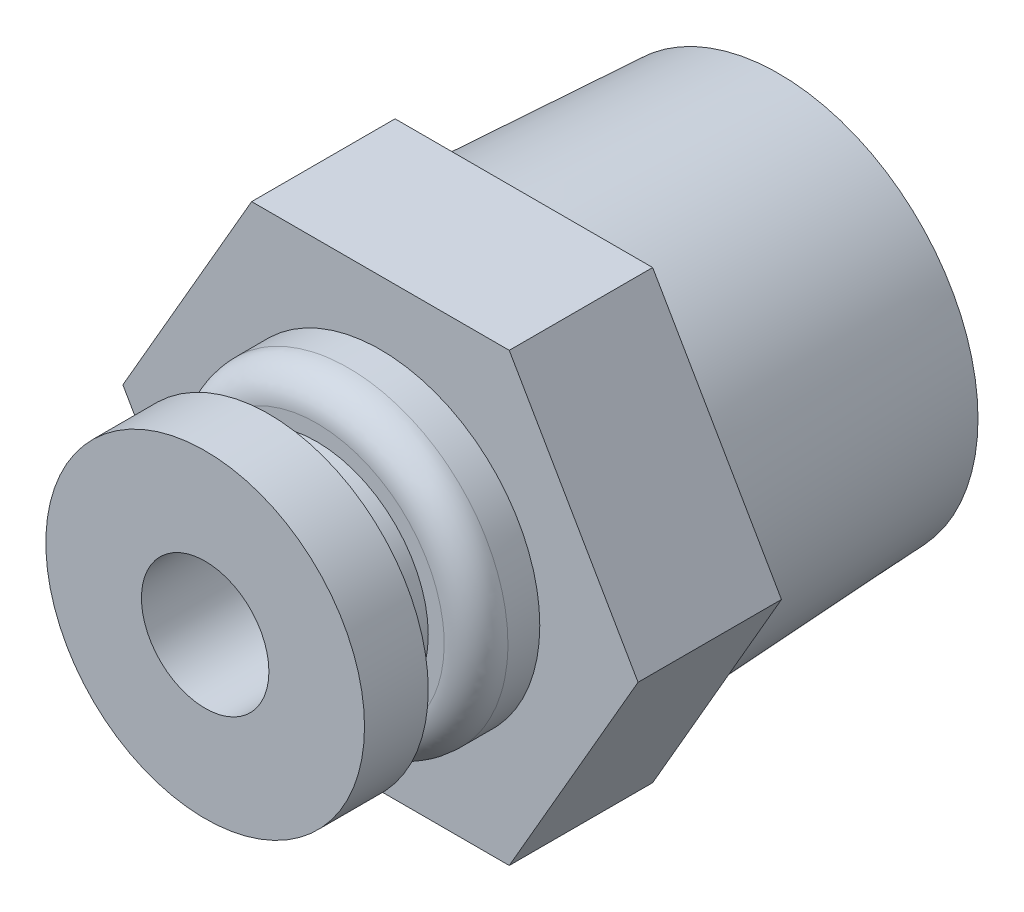
ISO-10303-21;
HEADER;
FILE_DESCRIPTION(('STEP AP214'),'2;1');
FILE_NAME('part.step','',(''),(''),'','','');
FILE_SCHEMA(('AUTOMOTIVE_DESIGN { 1 0 10303 214 1 1 1 1 }'));
ENDSEC;
DATA;
#1=APPLICATION_CONTEXT('core data for automotive mechanical design processes');
#2=APPLICATION_PROTOCOL_DEFINITION('international standard','automotive_design',2000,#1);
#3=PRODUCT_CONTEXT('',#1,'mechanical');
#4=PRODUCT('Part','Part','',(#3));
#5=PRODUCT_RELATED_PRODUCT_CATEGORY('part','',(#4));
#6=PRODUCT_DEFINITION_FORMATION('','',#4);
#7=PRODUCT_DEFINITION_CONTEXT('part definition',#1,'design');
#8=PRODUCT_DEFINITION('design','',#6,#7);
#9=PRODUCT_DEFINITION_SHAPE('','',#8);
#10=(LENGTH_UNIT() NAMED_UNIT(*) SI_UNIT(.MILLI.,.METRE.));
#11=(NAMED_UNIT(*) PLANE_ANGLE_UNIT() SI_UNIT($,.RADIAN.));
#12=(NAMED_UNIT(*) SI_UNIT($,.STERADIAN.) SOLID_ANGLE_UNIT());
#13=UNCERTAINTY_MEASURE_WITH_UNIT(LENGTH_MEASURE(1.E-05),#10,'distance_accuracy_value','');
#14=(GEOMETRIC_REPRESENTATION_CONTEXT(3) GLOBAL_UNCERTAINTY_ASSIGNED_CONTEXT((#13)) GLOBAL_UNIT_ASSIGNED_CONTEXT((#10,
#11,#12)) REPRESENTATION_CONTEXT('',''));
#15=CARTESIAN_POINT('',(0.,0.,0.));
#16=DIRECTION('',(0.,0.,1.));
#17=DIRECTION('',(1.,0.,0.));
#18=AXIS2_PLACEMENT_3D('',#15,#16,#17);
#19=CARTESIAN_POINT('',(0.,0.,0.));
#20=DIRECTION('',(0.,0.,1.));
#21=DIRECTION('',(1.,0.,0.));
#22=AXIS2_PLACEMENT_3D('',#19,#20,#21);
#23=CONICAL_SURFACE('',#22,6.25,0.05235987755983);
#24=CARTESIAN_POINT('',(0.,0.,8.));
#25=DIRECTION('',(0.,0.,1.));
#26=DIRECTION('',(1.,0.,0.));
#27=AXIS2_PLACEMENT_3D('',#24,#25,#26);
#28=CIRCLE('',#27,6.66926223426433);
#29=CARTESIAN_POINT('',(6.66926223426433,0.,8.));
#30=VERTEX_POINT('',#29);
#31=EDGE_CURVE('E168',#30,#30,#28,.T.);
#32=ORIENTED_EDGE('',*,*,#31,.F.);
#33=EDGE_LOOP('',(#32));
#34=FACE_BOUND('',#33,.T.);
#35=CARTESIAN_POINT('',(0.,0.,0.));
#36=DIRECTION('',(0.,0.,1.));
#37=DIRECTION('',(1.,0.,0.));
#38=AXIS2_PLACEMENT_3D('',#35,#36,#37);
#39=CIRCLE('',#38,6.25);
#40=CARTESIAN_POINT('',(6.25,0.,0.));
#41=VERTEX_POINT('',#40);
#42=EDGE_CURVE('E165',#41,#41,#39,.T.);
#43=ORIENTED_EDGE('',*,*,#42,.T.);
#44=EDGE_LOOP('',(#43));
#45=FACE_BOUND('',#44,.T.);
#46=ADVANCED_FACE('F41',(#34,#45),#23,.T.);
#47=CARTESIAN_POINT('',(0.,0.,0.));
#48=DIRECTION('',(0.,0.,1.));
#49=DIRECTION('',(1.,0.,0.));
#50=AXIS2_PLACEMENT_3D('',#47,#48,#49);
#51=PLANE('',#50);
#52=CARTESIAN_POINT('',(0.,0.,0.));
#53=DIRECTION('',(0.,0.,-1.));
#54=DIRECTION('',(-1.,0.,0.));
#55=AXIS2_PLACEMENT_3D('',#52,#53,#54);
#56=CIRCLE('',#55,4.5);
#57=CARTESIAN_POINT('',(-4.5,0.,0.));
#58=VERTEX_POINT('',#57);
#59=EDGE_CURVE('E486',#58,#58,#56,.T.);
#60=ORIENTED_EDGE('',*,*,#59,.F.);
#61=EDGE_LOOP('',(#60));
#62=FACE_BOUND('',#61,.T.);
#63=ORIENTED_EDGE('',*,*,#42,.F.);
#64=EDGE_LOOP('',(#63));
#65=FACE_BOUND('',#64,.T.);
#66=ADVANCED_FACE('F243',(#62,#65),#51,.F.);
#67=CARTESIAN_POINT('',(4.04145188432738,-7.,12.5));
#68=DIRECTION('',(-0.866025403784439,0.499999999999999,0.));
#69=DIRECTION('',(-0.499999999999999,-0.866025403784439,0.));
#70=AXIS2_PLACEMENT_3D('',#67,#68,#69);
#71=PLANE('',#70);
#72=DIRECTION('',(0.499999999999999,0.866025403784439,0.));
#73=VECTOR('',#72,1.);
#74=CARTESIAN_POINT('',(4.04145188432738,-7.,8.));
#75=LINE('',#74,#73);
#76=CARTESIAN_POINT('',(4.04145188432738,-7.,8.));
#77=VERTEX_POINT('',#76);
#78=CARTESIAN_POINT('',(8.08290376865476,0.,8.));
#79=VERTEX_POINT('',#78);
#80=EDGE_CURVE('E144',#77,#79,#75,.T.);
#81=ORIENTED_EDGE('',*,*,#80,.T.);
#82=DIRECTION('',(0.,0.,-1.));
#83=VECTOR('',#82,1.);
#84=CARTESIAN_POINT('',(8.08290376865476,0.,12.5));
#85=LINE('',#84,#83);
#86=CARTESIAN_POINT('',(8.08290376865476,0.,12.5));
#87=VERTEX_POINT('',#86);
#88=EDGE_CURVE('E163',#87,#79,#85,.T.);
#89=ORIENTED_EDGE('',*,*,#88,.F.);
#90=DIRECTION('',(0.499999999999999,0.866025403784439,0.));
#91=VECTOR('',#90,1.);
#92=CARTESIAN_POINT('',(4.04145188432738,-7.,12.5));
#93=LINE('',#92,#91);
#94=CARTESIAN_POINT('',(4.04145188432738,-7.,12.5));
#95=VERTEX_POINT('',#94);
#96=EDGE_CURVE('E156',#95,#87,#93,.T.);
#97=ORIENTED_EDGE('',*,*,#96,.F.);
#98=DIRECTION('',(0.,0.,-1.));
#99=VECTOR('',#98,1.);
#100=CARTESIAN_POINT('',(4.04145188432738,-7.,12.5));
#101=LINE('',#100,#99);
#102=EDGE_CURVE('E140',#95,#77,#101,.T.);
#103=ORIENTED_EDGE('',*,*,#102,.T.);
#104=EDGE_LOOP('',(#81,#89,#97,#103));
#105=FACE_BOUND('',#104,.T.);
#106=ADVANCED_FACE('F241',(#105),#71,.F.);
#107=CARTESIAN_POINT('',(8.08290376865476,0.,12.5));
#108=DIRECTION('',(-0.866025403784438,-0.5,0.));
#109=DIRECTION('',(0.5,-0.866025403784439,0.));
#110=AXIS2_PLACEMENT_3D('',#107,#108,#109);
#111=PLANE('',#110);
#112=DIRECTION('',(-0.5,0.866025403784438,0.));
#113=VECTOR('',#112,1.);
#114=CARTESIAN_POINT('',(8.08290376865476,0.,8.));
#115=LINE('',#114,#113);
#116=CARTESIAN_POINT('',(4.04145188432738,7.,8.));
#117=VERTEX_POINT('',#116);
#118=EDGE_CURVE('E147',#79,#117,#115,.T.);
#119=ORIENTED_EDGE('',*,*,#118,.T.);
#120=DIRECTION('',(0.,0.,-1.));
#121=VECTOR('',#120,1.);
#122=CARTESIAN_POINT('',(4.04145188432738,7.,12.5));
#123=LINE('',#122,#121);
#124=CARTESIAN_POINT('',(4.04145188432738,7.,12.5));
#125=VERTEX_POINT('',#124);
#126=EDGE_CURVE('E160',#125,#117,#123,.T.);
#127=ORIENTED_EDGE('',*,*,#126,.F.);
#128=DIRECTION('',(-0.5,0.866025403784438,0.));
#129=VECTOR('',#128,1.);
#130=CARTESIAN_POINT('',(8.08290376865476,0.,12.5));
#131=LINE('',#130,#129);
#132=EDGE_CURVE('E107',#87,#125,#131,.T.);
#133=ORIENTED_EDGE('',*,*,#132,.F.);
#134=ORIENTED_EDGE('',*,*,#88,.T.);
#135=EDGE_LOOP('',(#119,#127,#133,#134));
#136=FACE_BOUND('',#135,.T.);
#137=ADVANCED_FACE('F233',(#136),#111,.F.);
#138=CARTESIAN_POINT('',(4.04145188432738,7.,12.5));
#139=DIRECTION('',(0.,-1.,0.));
#140=DIRECTION('',(1.,0.,0.));
#141=AXIS2_PLACEMENT_3D('',#138,#139,#140);
#142=PLANE('',#141);
#143=DIRECTION('',(-1.,0.,0.));
#144=VECTOR('',#143,1.);
#145=CARTESIAN_POINT('',(4.04145188432738,7.,8.));
#146=LINE('',#145,#144);
#147=CARTESIAN_POINT('',(-4.04145188432738,7.,8.));
#148=VERTEX_POINT('',#147);
#149=EDGE_CURVE('E150',#117,#148,#146,.T.);
#150=ORIENTED_EDGE('',*,*,#149,.T.);
#151=DIRECTION('',(0.,0.,-1.));
#152=VECTOR('',#151,1.);
#153=CARTESIAN_POINT('',(-4.04145188432738,7.,12.5));
#154=LINE('',#153,#152);
#155=CARTESIAN_POINT('',(-4.04145188432738,7.,12.5));
#156=VERTEX_POINT('',#155);
#157=EDGE_CURVE('E135',#156,#148,#154,.T.);
#158=ORIENTED_EDGE('',*,*,#157,.F.);
#159=DIRECTION('',(-1.,0.,0.));
#160=VECTOR('',#159,1.);
#161=CARTESIAN_POINT('',(4.04145188432738,7.,12.5));
#162=LINE('',#161,#160);
#163=EDGE_CURVE('E123',#125,#156,#162,.T.);
#164=ORIENTED_EDGE('',*,*,#163,.F.);
#165=ORIENTED_EDGE('',*,*,#126,.T.);
#166=EDGE_LOOP('',(#150,#158,#164,#165));
#167=FACE_BOUND('',#166,.T.);
#168=ADVANCED_FACE('F236',(#167),#142,.F.);
#169=CARTESIAN_POINT('',(-4.04145188432738,7.,12.5));
#170=DIRECTION('',(0.866025403784439,-0.499999999999999,0.));
#171=DIRECTION('',(0.5,0.866025403784439,0.));
#172=AXIS2_PLACEMENT_3D('',#169,#170,#171);
#173=PLANE('',#172);
#174=DIRECTION('',(-0.499999999999999,-0.866025403784439,0.));
#175=VECTOR('',#174,1.);
#176=CARTESIAN_POINT('',(-4.04145188432738,7.,8.));
#177=LINE('',#176,#175);
#178=CARTESIAN_POINT('',(-8.08290376865476,0.,8.));
#179=VERTEX_POINT('',#178);
#180=EDGE_CURVE('E132',#148,#179,#177,.T.);
#181=ORIENTED_EDGE('',*,*,#180,.T.);
#182=DIRECTION('',(0.,0.,-1.));
#183=VECTOR('',#182,1.);
#184=CARTESIAN_POINT('',(-8.08290376865476,0.,12.5));
#185=LINE('',#184,#183);
#186=CARTESIAN_POINT('',(-8.08290376865476,0.,12.5));
#187=VERTEX_POINT('',#186);
#188=EDGE_CURVE('E129',#187,#179,#185,.T.);
#189=ORIENTED_EDGE('',*,*,#188,.F.);
#190=DIRECTION('',(-0.499999999999999,-0.866025403784439,0.));
#191=VECTOR('',#190,1.);
#192=CARTESIAN_POINT('',(-4.04145188432738,7.,12.5));
#193=LINE('',#192,#191);
#194=EDGE_CURVE('E116',#156,#187,#193,.T.);
#195=ORIENTED_EDGE('',*,*,#194,.F.);
#196=ORIENTED_EDGE('',*,*,#157,.T.);
#197=EDGE_LOOP('',(#181,#189,#195,#196));
#198=FACE_BOUND('',#197,.T.);
#199=ADVANCED_FACE('F130',(#198),#173,.F.);
#200=CARTESIAN_POINT('',(-8.08290376865476,0.,12.5));
#201=DIRECTION('',(0.866025403784438,0.5,0.));
#202=DIRECTION('',(-0.5,0.866025403784438,0.));
#203=AXIS2_PLACEMENT_3D('',#200,#201,#202);
#204=PLANE('',#203);
#205=DIRECTION('',(0.5,-0.866025403784438,0.));
#206=VECTOR('',#205,1.);
#207=CARTESIAN_POINT('',(-8.08290376865476,0.,8.));
#208=LINE('',#207,#206);
#209=CARTESIAN_POINT('',(-4.04145188432738,-7.,8.));
#210=VERTEX_POINT('',#209);
#211=EDGE_CURVE('E153',#179,#210,#208,.T.);
#212=ORIENTED_EDGE('',*,*,#211,.T.);
#213=DIRECTION('',(0.,0.,-1.));
#214=VECTOR('',#213,1.);
#215=CARTESIAN_POINT('',(-4.04145188432738,-7.,12.5));
#216=LINE('',#215,#214);
#217=CARTESIAN_POINT('',(-4.04145188432738,-7.,12.5));
#218=VERTEX_POINT('',#217);
#219=EDGE_CURVE('E136',#218,#210,#216,.T.);
#220=ORIENTED_EDGE('',*,*,#219,.F.);
#221=DIRECTION('',(0.5,-0.866025403784438,0.));
#222=VECTOR('',#221,1.);
#223=CARTESIAN_POINT('',(-8.08290376865476,0.,12.5));
#224=LINE('',#223,#222);
#225=EDGE_CURVE('E120',#187,#218,#224,.T.);
#226=ORIENTED_EDGE('',*,*,#225,.F.);
#227=ORIENTED_EDGE('',*,*,#188,.T.);
#228=EDGE_LOOP('',(#212,#220,#226,#227));
#229=FACE_BOUND('',#228,.T.);
#230=ADVANCED_FACE('F138',(#229),#204,.F.);
#231=CARTESIAN_POINT('',(-4.04145188432738,-7.,12.5));
#232=DIRECTION('',(0.,1.,0.));
#233=DIRECTION('',(-1.,0.,0.));
#234=AXIS2_PLACEMENT_3D('',#231,#232,#233);
#235=PLANE('',#234);
#236=DIRECTION('',(1.,0.,0.));
#237=VECTOR('',#236,1.);
#238=CARTESIAN_POINT('',(-4.04145188432738,-7.,8.));
#239=LINE('',#238,#237);
#240=EDGE_CURVE('E98',#210,#77,#239,.T.);
#241=ORIENTED_EDGE('',*,*,#240,.T.);
#242=ORIENTED_EDGE('',*,*,#102,.F.);
#243=DIRECTION('',(1.,0.,0.));
#244=VECTOR('',#243,1.);
#245=CARTESIAN_POINT('',(-4.04145188432738,-7.,12.5));
#246=LINE('',#245,#244);
#247=EDGE_CURVE('E71',#218,#95,#246,.T.);
#248=ORIENTED_EDGE('',*,*,#247,.F.);
#249=ORIENTED_EDGE('',*,*,#219,.T.);
#250=EDGE_LOOP('',(#241,#242,#248,#249));
#251=FACE_BOUND('',#250,.T.);
#252=ADVANCED_FACE('F239',(#251),#235,.F.);
#253=CARTESIAN_POINT('',(0.,0.,12.5));
#254=DIRECTION('',(0.,0.,1.));
#255=DIRECTION('',(1.,0.,0.));
#256=AXIS2_PLACEMENT_3D('',#253,#254,#255);
#257=PLANE('',#256);
#258=CARTESIAN_POINT('',(0.,0.,12.5));
#259=DIRECTION('',(0.,0.,1.));
#260=DIRECTION('',(1.,0.,0.));
#261=AXIS2_PLACEMENT_3D('',#258,#259,#260);
#262=CIRCLE('',#261,5.);
#263=CARTESIAN_POINT('',(5.,0.,12.5));
#264=VERTEX_POINT('',#263);
#265=EDGE_CURVE('E171',#264,#264,#262,.T.);
#266=ORIENTED_EDGE('',*,*,#265,.F.);
#267=EDGE_LOOP('',(#266));
#268=FACE_BOUND('',#267,.T.);
#269=ORIENTED_EDGE('',*,*,#96,.T.);
#270=ORIENTED_EDGE('',*,*,#132,.T.);
#271=ORIENTED_EDGE('',*,*,#163,.T.);
#272=ORIENTED_EDGE('',*,*,#194,.T.);
#273=ORIENTED_EDGE('',*,*,#225,.T.);
#274=ORIENTED_EDGE('',*,*,#247,.T.);
#275=EDGE_LOOP('',(#269,#270,#271,#272,#273,#274));
#276=FACE_BOUND('',#275,.T.);
#277=ADVANCED_FACE('F118',(#268,#276),#257,.T.);
#278=CARTESIAN_POINT('',(0.,0.,8.));
#279=DIRECTION('',(0.,0.,1.));
#280=DIRECTION('',(1.,0.,0.));
#281=AXIS2_PLACEMENT_3D('',#278,#279,#280);
#282=PLANE('',#281);
#283=ORIENTED_EDGE('',*,*,#31,.T.);
#284=EDGE_LOOP('',(#283));
#285=FACE_BOUND('',#284,.T.);
#286=ORIENTED_EDGE('',*,*,#80,.F.);
#287=ORIENTED_EDGE('',*,*,#240,.F.);
#288=ORIENTED_EDGE('',*,*,#211,.F.);
#289=ORIENTED_EDGE('',*,*,#180,.F.);
#290=ORIENTED_EDGE('',*,*,#149,.F.);
#291=ORIENTED_EDGE('',*,*,#118,.F.);
#292=EDGE_LOOP('',(#286,#287,#288,#289,#290,#291));
#293=FACE_BOUND('',#292,.T.);
#294=ADVANCED_FACE('F199',(#285,#293),#282,.F.);
#295=CARTESIAN_POINT('',(0.,0.,14.5));
#296=DIRECTION('',(0.,0.,-1.));
#297=DIRECTION('',(-1.,0.,0.));
#298=AXIS2_PLACEMENT_3D('',#295,#296,#297);
#299=CYLINDRICAL_SURFACE('',#298,5.);
#300=CARTESIAN_POINT('',(5.,0.,13.5));
#301=CARTESIAN_POINT('',(5.,0.654498465135206,13.5));
#302=CARTESIAN_POINT('',(4.86986338167185,1.30873942582747,13.5));
#303=CARTESIAN_POINT('',(4.36893194344101,2.51809489782343,13.5));
#304=CARTESIAN_POINT('',(3.99833420890498,3.0727336029605,13.5));
#305=CARTESIAN_POINT('',(3.0727336029605,3.99833420890498,13.5));
#306=CARTESIAN_POINT('',(2.51809489782326,4.36893194344108,13.5));
#307=CARTESIAN_POINT('',(1.30873942582763,4.86986338167179,13.5));
#308=CARTESIAN_POINT('',(0.654498465134551,5.,13.5));
#309=CARTESIAN_POINT('',(-0.65449846513455,5.,13.5));
#310=CARTESIAN_POINT('',(-1.30873942582729,4.86986338167193,13.5));
#311=CARTESIAN_POINT('',(-2.51809489782361,4.36893194344094,13.5));
#312=CARTESIAN_POINT('',(-3.07273360296,3.99833420890547,13.5));
#313=CARTESIAN_POINT('',(-3.99833420890548,3.07273360296,13.5));
#314=CARTESIAN_POINT('',(-4.36893194344115,2.51809489782309,13.5));
#315=CARTESIAN_POINT('',(-4.86986338167171,1.30873942582782,13.5));
#316=CARTESIAN_POINT('',(-5.,0.654498465134426,13.5));
#317=CARTESIAN_POINT('',(-5.,-0.654498465134425,13.5));
#318=CARTESIAN_POINT('',(-4.86986338167181,-1.30873942582757,13.5));
#319=CARTESIAN_POINT('',(-4.36893194344106,-2.51809489782332,13.5));
#320=CARTESIAN_POINT('',(-3.99833420890554,-3.07273360295993,13.5));
#321=CARTESIAN_POINT('',(-3.07273360295993,-3.99833420890555,13.5));
#322=CARTESIAN_POINT('',(-2.5180948978234,-4.36893194344102,13.5));
#323=CARTESIAN_POINT('',(-1.30873942582751,-4.86986338167184,13.5));
#324=CARTESIAN_POINT('',(-0.654498465134541,-5.,13.5));
#325=CARTESIAN_POINT('',(0.654498465134561,-5.,13.5));
#326=CARTESIAN_POINT('',(1.30873942582734,-4.86986338167191,13.5));
#327=CARTESIAN_POINT('',(2.51809489782355,-4.36893194344096,13.5));
#328=CARTESIAN_POINT('',(3.07273360296003,-3.99833420890545,13.5));
#329=CARTESIAN_POINT('',(3.99833420890543,-3.07273360296004,13.5));
#330=CARTESIAN_POINT('',(4.36893194344097,-2.51809489782352,13.5));
#331=CARTESIAN_POINT('',(4.86986338167189,-1.30873942582739,13.5));
#332=CARTESIAN_POINT('',(5.,-0.654498465135205,13.5));
#333=CARTESIAN_POINT('',(5.,0.,13.5));
#334=(BOUNDED_CURVE() B_SPLINE_CURVE(3,(#300,#301,#302,#303,#304,#305,#306,#307,#308,#309,#310,
#311,#312,#313,#314,#315,#316,#317,#318,#319,#320,#321,#322,#323,#324,#325,#326,#327,#328,#329,
#330,#331,#332,#333),.UNSPECIFIED.,.T.,.F.) B_SPLINE_CURVE_WITH_KNOTS((4,2,2,2,2,2,2,2,2,2,2,2,
2,2,2,2,4),(0.,0.392699081698724,0.785398163397448,1.17809724509617,1.5707963267949,
1.96349540849362,2.35619449019234,2.74889357189107,3.14159265358979,3.53429173528852,
3.92699081698724,4.31968989868597,4.71238898038469,5.10508806208341,5.49778714378214,
5.89048622548086,6.28318530717959),
.UNSPECIFIED.) CURVE() GEOMETRIC_REPRESENTATION_ITEM() RATIONAL_B_SPLINE_CURVE((1.,1.,1.,1.,1.,
1.,1.,1.,1.,1.,1.,1.,1.,1.,1.,1.,1.,1.,1.,1.,1.,1.,1.,1.,1.,1.,1.,1.,1.,1.,1.,1.,1.,1.)) REPRESENTATION_ITEM(''));
#335=CARTESIAN_POINT('',(5.,0.,13.5));
#336=VERTEX_POINT('',#335);
#337=EDGE_CURVE('E54',#336,#336,#334,.F.);
#338=ORIENTED_EDGE('',*,*,#337,.T.);
#339=EDGE_LOOP('',(#338));
#340=FACE_BOUND('',#339,.T.);
#341=ORIENTED_EDGE('',*,*,#265,.T.);
#342=EDGE_LOOP('',(#341));
#343=FACE_BOUND('',#342,.T.);
#344=ADVANCED_FACE('F194',(#340,#343),#299,.T.);
#345=CARTESIAN_POINT('',(0.,0.,14.5));
#346=DIRECTION('',(0.,0.,1.));
#347=DIRECTION('',(1.,0.,0.));
#348=AXIS2_PLACEMENT_3D('',#345,#346,#347);
#349=PLANE('',#348);
#350=CARTESIAN_POINT('',(4.,0.,14.5));
#351=CARTESIAN_POINT('',(4.,-0.523598772108514,14.5));
#352=CARTESIAN_POINT('',(3.89589070533714,-1.04699154066209,14.5));
#353=CARTESIAN_POINT('',(3.49514555475315,-2.01447591825864,14.5));
#354=CARTESIAN_POINT('',(3.19866736712426,-2.45818688236784,14.5));
#355=CARTESIAN_POINT('',(2.45818688236811,-3.19866736712456,14.5));
#356=CARTESIAN_POINT('',(2.01447591825849,-3.49514555475273,14.5));
#357=CARTESIAN_POINT('',(1.04699154066222,-3.89589070533757,14.5));
#358=CARTESIAN_POINT('',(0.523598772107647,-4.,14.5));
#359=CARTESIAN_POINT('',(-0.523598772107635,-4.,14.5));
#360=CARTESIAN_POINT('',(-1.04699154066209,-3.89589070533742,14.5));
#361=CARTESIAN_POINT('',(-2.01447591825864,-3.49514555475287,14.5));
#362=CARTESIAN_POINT('',(-2.45818688236786,-3.19866736712438,14.5));
#363=CARTESIAN_POINT('',(-3.19866736712452,-2.458186882368,14.5));
#364=CARTESIAN_POINT('',(-3.49514555475285,-2.01447591825864,14.5));
#365=CARTESIAN_POINT('',(-3.89589070533745,-1.04699154066207,14.5));
#366=CARTESIAN_POINT('',(-4.,-0.52359877210764,14.5));
#367=CARTESIAN_POINT('',(-4.,0.523598772107641,14.5));
#368=CARTESIAN_POINT('',(-3.8958907053373,1.04699154066222,14.5));
#369=CARTESIAN_POINT('',(-3.49514555475299,2.01447591825851,14.5));
#370=CARTESIAN_POINT('',(-3.19866736712452,2.458186882368,14.5));
#371=CARTESIAN_POINT('',(-2.45818688236786,3.19866736712438,14.5));
#372=CARTESIAN_POINT('',(-2.01447591825865,3.49514555475271,14.5));
#373=CARTESIAN_POINT('',(-1.04699154066207,3.89589070533759,14.5));
#374=CARTESIAN_POINT('',(-0.52359877210764,4.,14.5));
#375=CARTESIAN_POINT('',(0.52359877210764,4.,14.5));
#376=CARTESIAN_POINT('',(1.04699154066207,3.89589070533744,14.5));
#377=CARTESIAN_POINT('',(2.01447591825864,3.49514555475285,14.5));
#378=CARTESIAN_POINT('',(2.458186882368,3.19866736712452,14.5));
#379=CARTESIAN_POINT('',(3.19866736712438,2.45818688236786,14.5));
#380=CARTESIAN_POINT('',(3.49514555475285,2.01447591825857,14.5));
#381=CARTESIAN_POINT('',(3.89589070533745,1.04699154066214,14.5));
#382=CARTESIAN_POINT('',(4.,0.523598772108514,14.5));
#383=CARTESIAN_POINT('',(4.,0.,14.5));
#384=(BOUNDED_CURVE() B_SPLINE_CURVE(3,(#350,#351,#352,#353,#354,#355,#356,#357,#358,#359,#360,
#361,#362,#363,#364,#365,#366,#367,#368,#369,#370,#371,#372,#373,#374,#375,#376,#377,#378,#379,
#380,#381,#382,#383),.UNSPECIFIED.,.T.,.F.) B_SPLINE_CURVE_WITH_KNOTS((4,2,2,2,2,2,2,2,2,2,2,2,
2,2,2,2,4),(0.,0.392699081698725,0.785398163397448,1.17809724509617,1.5707963267949,
1.96349540849362,2.35619449019234,2.74889357189107,3.14159265358979,3.53429173528852,
3.92699081698724,4.31968989868597,4.71238898038469,5.10508806208341,5.49778714378214,
5.89048622548086,6.28318530717959),
.UNSPECIFIED.) CURVE() GEOMETRIC_REPRESENTATION_ITEM() RATIONAL_B_SPLINE_CURVE((1.,1.,1.,1.,1.,
1.,1.,1.,1.,1.,1.,1.,1.,1.,1.,1.,1.,1.,1.,1.,1.,1.,1.,1.,1.,1.,1.,1.,1.,1.,1.,1.,1.,1.)) REPRESENTATION_ITEM(''));
#385=CARTESIAN_POINT('',(4.,0.,14.5));
#386=VERTEX_POINT('',#385);
#387=EDGE_CURVE('E176',#386,#386,#384,.F.);
#388=ORIENTED_EDGE('',*,*,#387,.T.);
#389=EDGE_LOOP('',(#388));
#390=FACE_BOUND('',#389,.T.);
#391=CARTESIAN_POINT('',(0.,0.,14.5));
#392=DIRECTION('',(0.,0.,1.));
#393=DIRECTION('',(1.,0.,0.));
#394=AXIS2_PLACEMENT_3D('',#391,#392,#393);
#395=CIRCLE('',#394,3.5);
#396=CARTESIAN_POINT('',(3.5,0.,14.5));
#397=VERTEX_POINT('',#396);
#398=EDGE_CURVE('E221',#397,#397,#395,.T.);
#399=ORIENTED_EDGE('',*,*,#398,.F.);
#400=EDGE_LOOP('',(#399));
#401=FACE_BOUND('',#400,.T.);
#402=ADVANCED_FACE('F183',(#390,#401),#349,.T.);
#403=CARTESIAN_POINT('',(0.,0.,15.));
#404=DIRECTION('',(0.,0.,-1.));
#405=DIRECTION('',(-1.,0.,0.));
#406=AXIS2_PLACEMENT_3D('',#403,#404,#405);
#407=CYLINDRICAL_SURFACE('',#406,3.5);
#408=CARTESIAN_POINT('',(0.,0.,15.));
#409=DIRECTION('',(0.,0.,1.));
#410=DIRECTION('',(1.,0.,0.));
#411=AXIS2_PLACEMENT_3D('',#408,#409,#410);
#412=CIRCLE('',#411,3.5);
#413=CARTESIAN_POINT('',(3.5,0.,15.));
#414=VERTEX_POINT('',#413);
#415=EDGE_CURVE('E148',#414,#414,#412,.T.);
#416=ORIENTED_EDGE('',*,*,#415,.F.);
#417=EDGE_LOOP('',(#416));
#418=FACE_BOUND('',#417,.T.);
#419=ORIENTED_EDGE('',*,*,#398,.T.);
#420=EDGE_LOOP('',(#419));
#421=FACE_BOUND('',#420,.T.);
#422=ADVANCED_FACE('F193',(#418,#421),#407,.T.);
#423=CARTESIAN_POINT('',(0.,0.,15.));
#424=DIRECTION('',(0.,0.,1.));
#425=DIRECTION('',(1.,0.,0.));
#426=AXIS2_PLACEMENT_3D('',#423,#424,#425);
#427=PLANE('',#426);
#428=CARTESIAN_POINT('',(0.,0.,15.));
#429=DIRECTION('',(0.,0.,1.));
#430=DIRECTION('',(1.,0.,0.));
#431=AXIS2_PLACEMENT_3D('',#428,#429,#430);
#432=CIRCLE('',#431,3.);
#433=CARTESIAN_POINT('',(3.,0.,15.));
#434=VERTEX_POINT('',#433);
#435=EDGE_CURVE('E14',#434,#434,#432,.T.);
#436=ORIENTED_EDGE('',*,*,#435,.F.);
#437=EDGE_LOOP('',(#436));
#438=FACE_BOUND('',#437,.T.);
#439=ORIENTED_EDGE('',*,*,#415,.T.);
#440=EDGE_LOOP('',(#439));
#441=FACE_BOUND('',#440,.T.);
#442=ADVANCED_FACE('F305',(#438,#441),#427,.T.);
#443=CARTESIAN_POINT('',(4.,0.,14.5));
#444=CARTESIAN_POINT('',(4.,0.523598772108514,14.5));
#445=CARTESIAN_POINT('',(3.89589070533745,1.04699154066214,14.5));
#446=CARTESIAN_POINT('',(3.49514555475285,2.01447591825857,14.5));
#447=CARTESIAN_POINT('',(3.19866736712438,2.45818688236786,14.5));
#448=CARTESIAN_POINT('',(2.458186882368,3.19866736712452,14.5));
#449=CARTESIAN_POINT('',(2.01447591825864,3.49514555475285,14.5));
#450=CARTESIAN_POINT('',(1.04699154066207,3.89589070533744,14.5));
#451=CARTESIAN_POINT('',(0.52359877210764,4.,14.5));
#452=CARTESIAN_POINT('',(-0.52359877210764,4.,14.5));
#453=CARTESIAN_POINT('',(-1.04699154066207,3.89589070533759,14.5));
#454=CARTESIAN_POINT('',(-2.01447591825865,3.49514555475271,14.5));
#455=CARTESIAN_POINT('',(-2.45818688236786,3.19866736712438,14.5));
#456=CARTESIAN_POINT('',(-3.19866736712452,2.458186882368,14.5));
#457=CARTESIAN_POINT('',(-3.49514555475299,2.01447591825851,14.5));
#458=CARTESIAN_POINT('',(-3.8958907053373,1.04699154066222,14.5));
#459=CARTESIAN_POINT('',(-4.,0.523598772107641,14.5));
#460=CARTESIAN_POINT('',(-4.,-0.52359877210764,14.5));
#461=CARTESIAN_POINT('',(-3.89589070533745,-1.04699154066207,14.5));
#462=CARTESIAN_POINT('',(-3.49514555475285,-2.01447591825864,14.5));
#463=CARTESIAN_POINT('',(-3.19866736712452,-2.458186882368,14.5));
#464=CARTESIAN_POINT('',(-2.45818688236786,-3.19866736712438,14.5));
#465=CARTESIAN_POINT('',(-2.01447591825864,-3.49514555475287,14.5));
#466=CARTESIAN_POINT('',(-1.04699154066209,-3.89589070533742,14.5));
#467=CARTESIAN_POINT('',(-0.523598772107635,-4.,14.5));
#468=CARTESIAN_POINT('',(0.523598772107647,-4.,14.5));
#469=CARTESIAN_POINT('',(1.04699154066222,-3.89589070533757,14.5));
#470=CARTESIAN_POINT('',(2.01447591825849,-3.49514555475273,14.5));
#471=CARTESIAN_POINT('',(2.45818688236811,-3.19866736712456,14.5));
#472=CARTESIAN_POINT('',(3.19866736712426,-2.45818688236784,14.5));
#473=CARTESIAN_POINT('',(3.49514555475315,-2.01447591825864,14.5));
#474=CARTESIAN_POINT('',(3.89589070533714,-1.04699154066209,14.5));
#475=CARTESIAN_POINT('',(4.,-0.523598772108514,14.5));
#476=CARTESIAN_POINT('',(4.,0.,14.5));
#477=CARTESIAN_POINT('',(5.,0.,14.5));
#478=CARTESIAN_POINT('',(5.,0.654498465135206,14.5));
#479=CARTESIAN_POINT('',(4.86986338167206,1.3087394258277,14.5));
#480=CARTESIAN_POINT('',(4.36893194344082,2.5180948978232,14.5));
#481=CARTESIAN_POINT('',(3.99833420890484,3.0727336029605,14.5));
#482=CARTESIAN_POINT('',(3.07273360296064,3.99833420890498,14.5));
#483=CARTESIAN_POINT('',(2.5180948978232,4.3689319434411,14.5));
#484=CARTESIAN_POINT('',(1.30873942582769,4.86986338167177,14.5));
#485=CARTESIAN_POINT('',(0.654498465134552,5.,14.5));
#486=CARTESIAN_POINT('',(-0.65449846513455,5.,14.5));
#487=CARTESIAN_POINT('',(-1.30873942582741,4.86986338167206,14.5));
#488=CARTESIAN_POINT('',(-2.51809489782349,4.36893194344081,14.5));
#489=CARTESIAN_POINT('',(-3.07273360295993,3.9983342089054,14.5));
#490=CARTESIAN_POINT('',(-3.99833420890555,3.07273360296007,14.5));
#491=CARTESIAN_POINT('',(-4.3689319434411,2.51809489782293,14.5));
#492=CARTESIAN_POINT('',(-4.86986338167177,1.30873942582799,14.5));
#493=CARTESIAN_POINT('',(-5.,0.654498465134426,14.5));
#494=CARTESIAN_POINT('',(-5.,-0.654498465134425,14.5));
#495=CARTESIAN_POINT('',(-4.86986338167177,-1.30873942582762,14.5));
#496=CARTESIAN_POINT('',(-4.3689319434411,-2.51809489782327,14.5));
#497=CARTESIAN_POINT('',(-3.99833420890583,-3.07273360295994,14.5));
#498=CARTESIAN_POINT('',(-3.07273360295964,-3.99833420890555,14.5));
#499=CARTESIAN_POINT('',(-2.51809489782342,-4.36893194344109,14.5));
#500=CARTESIAN_POINT('',(-1.30873942582748,-4.86986338167178,14.5));
#501=CARTESIAN_POINT('',(-0.654498465134542,-5.,14.5));
#502=CARTESIAN_POINT('',(0.654498465134561,-5.,14.5));
#503=CARTESIAN_POINT('',(1.30873942582733,-4.86986338167207,14.5));
#504=CARTESIAN_POINT('',(2.51809489782356,-4.36893194344081,14.5));
#505=CARTESIAN_POINT('',(3.0727336029601,-3.99833420890538,14.5));
#506=CARTESIAN_POINT('',(3.99833420890536,-3.07273360296012,14.5));
#507=CARTESIAN_POINT('',(4.36893194344109,-2.51809489782371,14.5));
#508=CARTESIAN_POINT('',(4.86986338167178,-1.3087394258272,14.5));
#509=CARTESIAN_POINT('',(5.,-0.654498465135205,14.5));
#510=CARTESIAN_POINT('',(5.,0.,14.5));
#511=CARTESIAN_POINT('',(5.,0.,13.5));
#512=CARTESIAN_POINT('',(5.,0.654498465135206,13.5));
#513=CARTESIAN_POINT('',(4.86986338167185,1.30873942582747,13.5));
#514=CARTESIAN_POINT('',(4.36893194344101,2.51809489782343,13.5));
#515=CARTESIAN_POINT('',(3.99833420890498,3.0727336029605,13.5));
#516=CARTESIAN_POINT('',(3.0727336029605,3.99833420890498,13.5));
#517=CARTESIAN_POINT('',(2.51809489782326,4.36893194344108,13.5));
#518=CARTESIAN_POINT('',(1.30873942582763,4.86986338167179,13.5));
#519=CARTESIAN_POINT('',(0.654498465134551,5.,13.5));
#520=CARTESIAN_POINT('',(-0.65449846513455,5.,13.5));
#521=CARTESIAN_POINT('',(-1.30873942582729,4.86986338167193,13.5));
#522=CARTESIAN_POINT('',(-2.51809489782361,4.36893194344094,13.5));
#523=CARTESIAN_POINT('',(-3.07273360296,3.99833420890547,13.5));
#524=CARTESIAN_POINT('',(-3.99833420890548,3.07273360296,13.5));
#525=CARTESIAN_POINT('',(-4.36893194344115,2.51809489782309,13.5));
#526=CARTESIAN_POINT('',(-4.86986338167171,1.30873942582782,13.5));
#527=CARTESIAN_POINT('',(-5.,0.654498465134426,13.5));
#528=CARTESIAN_POINT('',(-5.,-0.654498465134425,13.5));
#529=CARTESIAN_POINT('',(-4.86986338167181,-1.30873942582757,13.5));
#530=CARTESIAN_POINT('',(-4.36893194344106,-2.51809489782332,13.5));
#531=CARTESIAN_POINT('',(-3.99833420890554,-3.07273360295993,13.5));
#532=CARTESIAN_POINT('',(-3.07273360295993,-3.99833420890555,13.5));
#533=CARTESIAN_POINT('',(-2.5180948978234,-4.36893194344102,13.5));
#534=CARTESIAN_POINT('',(-1.30873942582751,-4.86986338167184,13.5));
#535=CARTESIAN_POINT('',(-0.654498465134541,-5.,13.5));
#536=CARTESIAN_POINT('',(0.654498465134561,-5.,13.5));
#537=CARTESIAN_POINT('',(1.30873942582734,-4.86986338167191,13.5));
#538=CARTESIAN_POINT('',(2.51809489782355,-4.36893194344096,13.5));
#539=CARTESIAN_POINT('',(3.07273360296003,-3.99833420890545,13.5));
#540=CARTESIAN_POINT('',(3.99833420890543,-3.07273360296004,13.5));
#541=CARTESIAN_POINT('',(4.36893194344097,-2.51809489782352,13.5));
#542=CARTESIAN_POINT('',(4.86986338167189,-1.30873942582739,13.5));
#543=CARTESIAN_POINT('',(5.,-0.654498465135205,13.5));
#544=CARTESIAN_POINT('',(5.,0.,13.5));
#545=(BOUNDED_SURFACE() B_SPLINE_SURFACE(2,3,((#443,#444,#445,#446,#447,#448,#449,#450,#451,
#452,#453,#454,#455,#456,#457,#458,#459,#460,#461,#462,#463,#464,#465,#466,#467,#468,#469,#470,
#471,#472,#473,#474,#475,#476),(#477,#478,#479,#480,#481,#482,#483,#484,#485,#486,#487,#488,
#489,#490,#491,#492,#493,#494,#495,#496,#497,#498,#499,#500,#501,#502,#503,#504,#505,#506,#507,
#508,#509,#510),(#511,#512,#513,#514,#515,#516,#517,#518,#519,#520,#521,#522,#523,#524,#525,
#526,#527,#528,#529,#530,#531,#532,#533,#534,#535,#536,#537,#538,#539,#540,#541,#542,#543,
#544)),.UNSPECIFIED.,.F.,.T.,.F.) B_SPLINE_SURFACE_WITH_KNOTS((3,3),(4,2,2,2,2,2,2,2,2,2,2,2,2,
2,2,2,4),(0.,1.),(0.,0.392699081698724,0.785398163397448,1.17809724509617,1.5707963267949,
1.96349540849362,2.35619449019234,2.74889357189107,3.14159265358979,3.53429173528852,
3.92699081698724,4.31968989868597,4.71238898038469,5.10508806208341,5.49778714378214,
5.89048622548086,6.28318530717959),
.UNSPECIFIED.) GEOMETRIC_REPRESENTATION_ITEM() RATIONAL_B_SPLINE_SURFACE(((1.,1.,1.,1.,1.,1.,1.,
1.,1.,1.,1.,1.,1.,1.,1.,1.,1.,1.,1.,1.,1.,1.,1.,1.,1.,1.,1.,1.,1.,1.,1.,1.,1.,1.),
(0.707106781186547,0.707106781186547,0.707106781186547,0.707106781186547,0.707106781186547,
0.707106781186547,0.707106781186547,0.707106781186547,0.707106781186547,0.707106781186547,
0.707106781186547,0.707106781186547,0.707106781186547,0.707106781186547,0.707106781186547,
0.707106781186547,0.707106781186547,0.707106781186547,0.707106781186547,0.707106781186547,
0.707106781186547,0.707106781186547,0.707106781186547,0.707106781186547,0.707106781186547,
0.707106781186547,0.707106781186547,0.707106781186547,0.707106781186547,0.707106781186547,
0.707106781186547,0.707106781186547,0.707106781186547,0.707106781186547),(1.,1.,1.,1.,1.,1.,1.,
1.,1.,1.,1.,1.,1.,1.,1.,1.,1.,1.,1.,1.,1.,1.,1.,1.,1.,1.,1.,1.,1.,1.,1.,1.,1.,1.))) REPRESENTATION_ITEM('') SURFACE());
#546=ORIENTED_EDGE('',*,*,#337,.F.);
#547=EDGE_LOOP('',(#546));
#548=FACE_BOUND('',#547,.T.);
#549=ORIENTED_EDGE('',*,*,#387,.F.);
#550=EDGE_LOOP('',(#549));
#551=FACE_BOUND('',#550,.T.);
#552=ADVANCED_FACE('F43',(#548,#551),#545,.T.);
#553=CARTESIAN_POINT('',(0.,0.,16.));
#554=DIRECTION('',(0.,0.,-1.));
#555=DIRECTION('',(-1.,0.,0.));
#556=AXIS2_PLACEMENT_3D('',#553,#554,#555);
#557=CYLINDRICAL_SURFACE('',#556,3.);
#558=CARTESIAN_POINT('',(0.,0.,16.));
#559=DIRECTION('',(0.,0.,1.));
#560=DIRECTION('',(1.,0.,0.));
#561=AXIS2_PLACEMENT_3D('',#558,#559,#560);
#562=CIRCLE('',#561,3.);
#563=CARTESIAN_POINT('',(3.,0.,16.));
#564=VERTEX_POINT('',#563);
#565=EDGE_CURVE('E553',#564,#564,#562,.T.);
#566=ORIENTED_EDGE('',*,*,#565,.F.);
#567=EDGE_LOOP('',(#566));
#568=FACE_BOUND('',#567,.T.);
#569=ORIENTED_EDGE('',*,*,#435,.T.);
#570=EDGE_LOOP('',(#569));
#571=FACE_BOUND('',#570,.T.);
#572=ADVANCED_FACE('F328',(#568,#571),#557,.T.);
#573=CARTESIAN_POINT('',(0.,0.,18.));
#574=DIRECTION('',(0.,0.,-1.));
#575=DIRECTION('',(-1.,0.,0.));
#576=AXIS2_PLACEMENT_3D('',#573,#574,#575);
#577=CYLINDRICAL_SURFACE('',#576,5.);
#578=CARTESIAN_POINT('',(0.,0.,18.));
#579=DIRECTION('',(0.,0.,1.));
#580=DIRECTION('',(1.,0.,0.));
#581=AXIS2_PLACEMENT_3D('',#578,#579,#580);
#582=CIRCLE('',#581,5.);
#583=CARTESIAN_POINT('',(5.,0.,18.));
#584=VERTEX_POINT('',#583);
#585=EDGE_CURVE('E550',#584,#584,#582,.T.);
#586=ORIENTED_EDGE('',*,*,#585,.F.);
#587=EDGE_LOOP('',(#586));
#588=FACE_BOUND('',#587,.T.);
#589=CARTESIAN_POINT('',(0.,0.,16.));
#590=DIRECTION('',(0.,0.,1.));
#591=DIRECTION('',(1.,0.,0.));
#592=AXIS2_PLACEMENT_3D('',#589,#590,#591);
#593=CIRCLE('',#592,5.);
#594=CARTESIAN_POINT('',(5.,0.,16.));
#595=VERTEX_POINT('',#594);
#596=EDGE_CURVE('E549',#595,#595,#593,.T.);
#597=ORIENTED_EDGE('',*,*,#596,.T.);
#598=EDGE_LOOP('',(#597));
#599=FACE_BOUND('',#598,.T.);
#600=ADVANCED_FACE('F342',(#588,#599),#577,.T.);
#601=CARTESIAN_POINT('',(0.,0.,18.));
#602=DIRECTION('',(0.,0.,1.));
#603=DIRECTION('',(1.,0.,0.));
#604=AXIS2_PLACEMENT_3D('',#601,#602,#603);
#605=PLANE('',#604);
#606=CARTESIAN_POINT('',(0.,0.,18.));
#607=DIRECTION('',(0.,0.,1.));
#608=DIRECTION('',(1.,0.,0.));
#609=AXIS2_PLACEMENT_3D('',#606,#607,#608);
#610=CIRCLE('',#609,2.);
#611=CARTESIAN_POINT('',(2.,0.,18.));
#612=VERTEX_POINT('',#611);
#613=EDGE_CURVE('E543',#612,#612,#610,.T.);
#614=ORIENTED_EDGE('',*,*,#613,.F.);
#615=EDGE_LOOP('',(#614));
#616=FACE_BOUND('',#615,.T.);
#617=ORIENTED_EDGE('',*,*,#585,.T.);
#618=EDGE_LOOP('',(#617));
#619=FACE_BOUND('',#618,.T.);
#620=ADVANCED_FACE('F352',(#616,#619),#605,.T.);
#621=CARTESIAN_POINT('',(0.,0.,16.));
#622=DIRECTION('',(0.,0.,1.));
#623=DIRECTION('',(1.,0.,0.));
#624=AXIS2_PLACEMENT_3D('',#621,#622,#623);
#625=PLANE('',#624);
#626=ORIENTED_EDGE('',*,*,#565,.T.);
#627=EDGE_LOOP('',(#626));
#628=FACE_BOUND('',#627,.T.);
#629=ORIENTED_EDGE('',*,*,#596,.F.);
#630=EDGE_LOOP('',(#629));
#631=FACE_BOUND('',#630,.T.);
#632=ADVANCED_FACE('F360',(#628,#631),#625,.F.);
#633=CARTESIAN_POINT('',(0.,0.,-1.15685424949238));
#634=DIRECTION('',(0.,0.,1.));
#635=DIRECTION('',(1.,0.,0.));
#636=AXIS2_PLACEMENT_3D('',#633,#634,#635);
#637=CYLINDRICAL_SURFACE('',#636,2.);
#638=CARTESIAN_POINT('',(0.,0.,8.5));
#639=DIRECTION('',(0.,0.,1.));
#640=DIRECTION('',(1.,0.,0.));
#641=AXIS2_PLACEMENT_3D('',#638,#639,#640);
#642=CIRCLE('',#641,2.);
#643=CARTESIAN_POINT('',(2.,0.,8.5));
#644=VERTEX_POINT('',#643);
#645=EDGE_CURVE('E546',#644,#644,#642,.F.);
#646=ORIENTED_EDGE('',*,*,#645,.T.);
#647=EDGE_LOOP('',(#646));
#648=FACE_BOUND('',#647,.T.);
#649=ORIENTED_EDGE('',*,*,#613,.T.);
#650=EDGE_LOOP('',(#649));
#651=FACE_BOUND('',#650,.T.);
#652=ADVANCED_FACE('F365',(#648,#651),#637,.F.);
#653=CARTESIAN_POINT('',(0.,0.,8.5));
#654=DIRECTION('',(0.,0.,1.));
#655=DIRECTION('',(1.,0.,0.));
#656=AXIS2_PLACEMENT_3D('',#653,#654,#655);
#657=PLANE('',#656);
#658=DIRECTION('',(0.866025403784439,-0.5,0.));
#659=VECTOR('',#658,1.);
#660=CARTESIAN_POINT('',(-1.5,-0.866025403784439,8.5));
#661=LINE('',#660,#659);
#662=CARTESIAN_POINT('',(-1.5,-0.866025403784439,8.5));
#663=VERTEX_POINT('',#662);
#664=CARTESIAN_POINT('',(0.,-1.73205080756888,8.5));
#665=VERTEX_POINT('',#664);
#666=EDGE_CURVE('E490',#663,#665,#661,.T.);
#667=ORIENTED_EDGE('',*,*,#666,.F.);
#668=DIRECTION('',(0.,-1.,0.));
#669=VECTOR('',#668,1.);
#670=CARTESIAN_POINT('',(-1.5,0.86602540378444,8.5));
#671=LINE('',#670,#669);
#672=CARTESIAN_POINT('',(-1.5,0.86602540378444,8.5));
#673=VERTEX_POINT('',#672);
#674=EDGE_CURVE('E523',#673,#663,#671,.T.);
#675=ORIENTED_EDGE('',*,*,#674,.F.);
#676=DIRECTION('',(-0.866025403784438,-0.5,0.));
#677=VECTOR('',#676,1.);
#678=CARTESIAN_POINT('',(0.,1.73205080756888,8.5));
#679=LINE('',#678,#677);
#680=CARTESIAN_POINT('',(0.,1.73205080756888,8.5));
#681=VERTEX_POINT('',#680);
#682=EDGE_CURVE('E62',#681,#673,#679,.T.);
#683=ORIENTED_EDGE('',*,*,#682,.F.);
#684=DIRECTION('',(-0.866025403784439,0.5,0.));
#685=VECTOR('',#684,1.);
#686=CARTESIAN_POINT('',(1.5,0.86602540378444,8.5));
#687=LINE('',#686,#685);
#688=CARTESIAN_POINT('',(1.5,0.86602540378444,8.5));
#689=VERTEX_POINT('',#688);
#690=EDGE_CURVE('E519',#689,#681,#687,.T.);
#691=ORIENTED_EDGE('',*,*,#690,.F.);
#692=DIRECTION('',(0.,1.,0.));
#693=VECTOR('',#692,1.);
#694=CARTESIAN_POINT('',(1.5,-0.86602540378444,8.5));
#695=LINE('',#694,#693);
#696=CARTESIAN_POINT('',(1.5,-0.86602540378444,8.5));
#697=VERTEX_POINT('',#696);
#698=EDGE_CURVE('E516',#697,#689,#695,.T.);
#699=ORIENTED_EDGE('',*,*,#698,.F.);
#700=DIRECTION('',(0.866025403784439,0.5,0.));
#701=VECTOR('',#700,1.);
#702=CARTESIAN_POINT('',(0.,-1.73205080756888,8.5));
#703=LINE('',#702,#701);
#704=EDGE_CURVE('E493',#665,#697,#703,.T.);
#705=ORIENTED_EDGE('',*,*,#704,.F.);
#706=EDGE_LOOP('',(#667,#675,#683,#691,#699,#705));
#707=FACE_BOUND('',#706,.T.);
#708=ORIENTED_EDGE('',*,*,#645,.F.);
#709=EDGE_LOOP('',(#708));
#710=FACE_BOUND('',#709,.T.);
#711=ADVANCED_FACE('F382',(#707,#710),#657,.T.);
#712=CARTESIAN_POINT('',(-1.5,-0.866025403784439,-8.58257569495584));
#713=DIRECTION('',(-0.5,-0.866025403784439,0.));
#714=DIRECTION('',(0.866025403784439,-0.5,0.));
#715=AXIS2_PLACEMENT_3D('',#712,#713,#714);
#716=PLANE('',#715);
#717=DIRECTION('',(-0.866025403784439,0.5,0.));
#718=VECTOR('',#717,1.);
#719=CARTESIAN_POINT('',(-1.5,-0.866025403784439,2.));
#720=LINE('',#719,#718);
#721=CARTESIAN_POINT('',(0.,-1.73205080756888,2.));
#722=VERTEX_POINT('',#721);
#723=CARTESIAN_POINT('',(-1.5,-0.866025403784439,2.));
#724=VERTEX_POINT('',#723);
#725=EDGE_CURVE('E510',#722,#724,#720,.T.);
#726=ORIENTED_EDGE('',*,*,#725,.T.);
#727=DIRECTION('',(0.,0.,1.));
#728=VECTOR('',#727,1.);
#729=CARTESIAN_POINT('',(-1.5,-0.866025403784439,-8.58257569495584));
#730=LINE('',#729,#728);
#731=EDGE_CURVE('E501',#724,#663,#730,.T.);
#732=ORIENTED_EDGE('',*,*,#731,.T.);
#733=ORIENTED_EDGE('',*,*,#666,.T.);
#734=DIRECTION('',(0.,0.,1.));
#735=VECTOR('',#734,1.);
#736=CARTESIAN_POINT('',(0.,-1.73205080756888,-8.58257569495584));
#737=LINE('',#736,#735);
#738=EDGE_CURVE('E526',#722,#665,#737,.T.);
#739=ORIENTED_EDGE('',*,*,#738,.F.);
#740=EDGE_LOOP('',(#726,#732,#733,#739));
#741=FACE_BOUND('',#740,.T.);
#742=ADVANCED_FACE('F392',(#741),#716,.F.);
#743=CARTESIAN_POINT('',(-1.5,0.86602540378444,-8.58257569495584));
#744=DIRECTION('',(-1.,0.,0.));
#745=DIRECTION('',(0.,0.,1.));
#746=AXIS2_PLACEMENT_3D('',#743,#744,#745);
#747=PLANE('',#746);
#748=DIRECTION('',(0.,1.,0.));
#749=VECTOR('',#748,1.);
#750=CARTESIAN_POINT('',(-1.5,0.86602540378444,2.));
#751=LINE('',#750,#749);
#752=CARTESIAN_POINT('',(-1.5,0.86602540378444,2.));
#753=VERTEX_POINT('',#752);
#754=EDGE_CURVE('E507',#724,#753,#751,.T.);
#755=ORIENTED_EDGE('',*,*,#754,.T.);
#756=DIRECTION('',(0.,0.,1.));
#757=VECTOR('',#756,1.);
#758=CARTESIAN_POINT('',(-1.5,0.86602540378444,-8.58257569495584));
#759=LINE('',#758,#757);
#760=EDGE_CURVE('E529',#753,#673,#759,.T.);
#761=ORIENTED_EDGE('',*,*,#760,.T.);
#762=ORIENTED_EDGE('',*,*,#674,.T.);
#763=ORIENTED_EDGE('',*,*,#731,.F.);
#764=EDGE_LOOP('',(#755,#761,#762,#763));
#765=FACE_BOUND('',#764,.T.);
#766=ADVANCED_FACE('F410',(#765),#747,.F.);
#767=CARTESIAN_POINT('',(0.,1.73205080756888,-8.58257569495584));
#768=DIRECTION('',(-0.5,0.866025403784438,0.));
#769=DIRECTION('',(-0.866025403784439,-0.5,0.));
#770=AXIS2_PLACEMENT_3D('',#767,#768,#769);
#771=PLANE('',#770);
#772=DIRECTION('',(0.866025403784439,0.5,0.));
#773=VECTOR('',#772,1.);
#774=CARTESIAN_POINT('',(0.,1.73205080756888,2.));
#775=LINE('',#774,#773);
#776=CARTESIAN_POINT('',(0.,1.73205080756888,2.));
#777=VERTEX_POINT('',#776);
#778=EDGE_CURVE('E504',#753,#777,#775,.T.);
#779=ORIENTED_EDGE('',*,*,#778,.T.);
#780=DIRECTION('',(0.,0.,1.));
#781=VECTOR('',#780,1.);
#782=CARTESIAN_POINT('',(0.,1.73205080756888,-8.58257569495584));
#783=LINE('',#782,#781);
#784=EDGE_CURVE('E531',#777,#681,#783,.T.);
#785=ORIENTED_EDGE('',*,*,#784,.T.);
#786=ORIENTED_EDGE('',*,*,#682,.T.);
#787=ORIENTED_EDGE('',*,*,#760,.F.);
#788=EDGE_LOOP('',(#779,#785,#786,#787));
#789=FACE_BOUND('',#788,.T.);
#790=ADVANCED_FACE('F420',(#789),#771,.F.);
#791=CARTESIAN_POINT('',(1.5,0.86602540378444,-8.58257569495584));
#792=DIRECTION('',(0.5,0.866025403784439,0.));
#793=DIRECTION('',(-0.866025403784439,0.5,0.));
#794=AXIS2_PLACEMENT_3D('',#791,#792,#793);
#795=PLANE('',#794);
#796=DIRECTION('',(0.866025403784439,-0.5,0.));
#797=VECTOR('',#796,1.);
#798=CARTESIAN_POINT('',(1.5,0.86602540378444,2.));
#799=LINE('',#798,#797);
#800=CARTESIAN_POINT('',(1.5,0.86602540378444,2.));
#801=VERTEX_POINT('',#800);
#802=EDGE_CURVE('E500',#777,#801,#799,.T.);
#803=ORIENTED_EDGE('',*,*,#802,.T.);
#804=DIRECTION('',(0.,0.,1.));
#805=VECTOR('',#804,1.);
#806=CARTESIAN_POINT('',(1.5,0.86602540378444,-8.58257569495584));
#807=LINE('',#806,#805);
#808=EDGE_CURVE('E533',#801,#689,#807,.T.);
#809=ORIENTED_EDGE('',*,*,#808,.T.);
#810=ORIENTED_EDGE('',*,*,#690,.T.);
#811=ORIENTED_EDGE('',*,*,#784,.F.);
#812=EDGE_LOOP('',(#803,#809,#810,#811));
#813=FACE_BOUND('',#812,.T.);
#814=ADVANCED_FACE('F430',(#813),#795,.F.);
#815=CARTESIAN_POINT('',(1.5,-0.86602540378444,-8.58257569495584));
#816=DIRECTION('',(1.,0.,0.));
#817=DIRECTION('',(0.,0.,-1.));
#818=AXIS2_PLACEMENT_3D('',#815,#816,#817);
#819=PLANE('',#818);
#820=DIRECTION('',(0.,-1.,0.));
#821=VECTOR('',#820,1.);
#822=CARTESIAN_POINT('',(1.5,-0.86602540378444,2.));
#823=LINE('',#822,#821);
#824=CARTESIAN_POINT('',(1.5,-0.86602540378444,2.));
#825=VERTEX_POINT('',#824);
#826=EDGE_CURVE('E497',#801,#825,#823,.T.);
#827=ORIENTED_EDGE('',*,*,#826,.T.);
#828=DIRECTION('',(0.,0.,1.));
#829=VECTOR('',#828,1.);
#830=CARTESIAN_POINT('',(1.5,-0.86602540378444,-8.58257569495584));
#831=LINE('',#830,#829);
#832=EDGE_CURVE('E536',#825,#697,#831,.T.);
#833=ORIENTED_EDGE('',*,*,#832,.T.);
#834=ORIENTED_EDGE('',*,*,#698,.T.);
#835=ORIENTED_EDGE('',*,*,#808,.F.);
#836=EDGE_LOOP('',(#827,#833,#834,#835));
#837=FACE_BOUND('',#836,.T.);
#838=ADVANCED_FACE('F439',(#837),#819,.F.);
#839=CARTESIAN_POINT('',(0.,-1.73205080756888,-8.58257569495584));
#840=DIRECTION('',(0.5,-0.866025403784439,0.));
#841=DIRECTION('',(0.866025403784439,0.5,0.));
#842=AXIS2_PLACEMENT_3D('',#839,#840,#841);
#843=PLANE('',#842);
#844=DIRECTION('',(-0.866025403784439,-0.5,0.));
#845=VECTOR('',#844,1.);
#846=CARTESIAN_POINT('',(0.,-1.73205080756888,2.));
#847=LINE('',#846,#845);
#848=EDGE_CURVE('E512',#825,#722,#847,.T.);
#849=ORIENTED_EDGE('',*,*,#848,.T.);
#850=ORIENTED_EDGE('',*,*,#738,.T.);
#851=ORIENTED_EDGE('',*,*,#704,.T.);
#852=ORIENTED_EDGE('',*,*,#832,.F.);
#853=EDGE_LOOP('',(#849,#850,#851,#852));
#854=FACE_BOUND('',#853,.T.);
#855=ADVANCED_FACE('F449',(#854),#843,.F.);
#856=CARTESIAN_POINT('',(0.,0.,2.));
#857=DIRECTION('',(0.,0.,1.));
#858=DIRECTION('',(1.,0.,0.));
#859=AXIS2_PLACEMENT_3D('',#856,#857,#858);
#860=PLANE('',#859);
#861=CARTESIAN_POINT('',(0.,0.,2.));
#862=DIRECTION('',(0.,0.,1.));
#863=DIRECTION('',(1.,0.,0.));
#864=AXIS2_PLACEMENT_3D('',#861,#862,#863);
#865=CIRCLE('',#864,4.5);
#866=CARTESIAN_POINT('',(4.5,0.,2.));
#867=VERTEX_POINT('',#866);
#868=EDGE_CURVE('E489',#867,#867,#865,.F.);
#869=ORIENTED_EDGE('',*,*,#868,.T.);
#870=EDGE_LOOP('',(#869));
#871=FACE_BOUND('',#870,.T.);
#872=ORIENTED_EDGE('',*,*,#848,.F.);
#873=ORIENTED_EDGE('',*,*,#826,.F.);
#874=ORIENTED_EDGE('',*,*,#802,.F.);
#875=ORIENTED_EDGE('',*,*,#778,.F.);
#876=ORIENTED_EDGE('',*,*,#754,.F.);
#877=ORIENTED_EDGE('',*,*,#725,.F.);
#878=EDGE_LOOP('',(#872,#873,#874,#875,#876,#877));
#879=FACE_BOUND('',#878,.T.);
#880=ADVANCED_FACE('F459',(#871,#879),#860,.F.);
#881=CARTESIAN_POINT('',(0.,0.,14.7279220613579));
#882=DIRECTION('',(0.,0.,-1.));
#883=DIRECTION('',(-1.,0.,0.));
#884=AXIS2_PLACEMENT_3D('',#881,#882,#883);
#885=CYLINDRICAL_SURFACE('',#884,4.5);
#886=ORIENTED_EDGE('',*,*,#59,.T.);
#887=EDGE_LOOP('',(#886));
#888=FACE_BOUND('',#887,.T.);
#889=ORIENTED_EDGE('',*,*,#868,.F.);
#890=EDGE_LOOP('',(#889));
#891=FACE_BOUND('',#890,.T.);
#892=ADVANCED_FACE('F469',(#888,#891),#885,.F.);
#893=CLOSED_SHELL('',(#46,#66,#106,#137,#168,#199,#230,#252,#277,#294,#344,#402,#422,#442,#552,
#572,#600,#620,#632,#652,#711,#742,#766,#790,#814,#838,#855,#880,#892));
#894=MANIFOLD_SOLID_BREP('B2',#893);
#895=ADVANCED_BREP_SHAPE_REPRESENTATION('',(#18,#894),#14);
#896=SHAPE_DEFINITION_REPRESENTATION(#9,#895);
ENDSEC;
END-ISO-10303-21;
